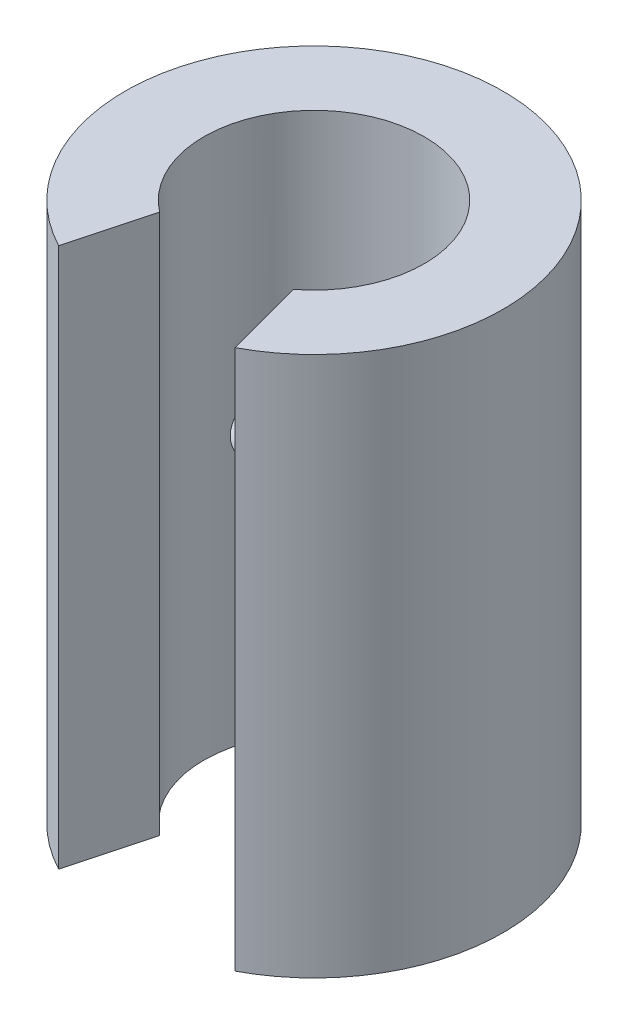
ISO-10303-21;
HEADER;
FILE_DESCRIPTION(('STEP AP214'),'2;1');
FILE_NAME('part.step','',(''),(''),'','','');
FILE_SCHEMA(('AUTOMOTIVE_DESIGN { 1 0 10303 214 1 1 1 1 }'));
ENDSEC;
DATA;
#1=APPLICATION_CONTEXT('core data for automotive mechanical design processes');
#2=APPLICATION_PROTOCOL_DEFINITION('international standard','automotive_design',2000,#1);
#3=PRODUCT_CONTEXT('',#1,'mechanical');
#4=PRODUCT('Part','Part','',(#3));
#5=PRODUCT_RELATED_PRODUCT_CATEGORY('part','',(#4));
#6=PRODUCT_DEFINITION_FORMATION('','',#4);
#7=PRODUCT_DEFINITION_CONTEXT('part definition',#1,'design');
#8=PRODUCT_DEFINITION('design','',#6,#7);
#9=PRODUCT_DEFINITION_SHAPE('','',#8);
#10=(LENGTH_UNIT() NAMED_UNIT(*) SI_UNIT(.MILLI.,.METRE.));
#11=(NAMED_UNIT(*) PLANE_ANGLE_UNIT() SI_UNIT($,.RADIAN.));
#12=(NAMED_UNIT(*) SI_UNIT($,.STERADIAN.) SOLID_ANGLE_UNIT());
#13=UNCERTAINTY_MEASURE_WITH_UNIT(LENGTH_MEASURE(1.E-05),#10,'distance_accuracy_value','');
#14=(GEOMETRIC_REPRESENTATION_CONTEXT(3) GLOBAL_UNCERTAINTY_ASSIGNED_CONTEXT((#13)) GLOBAL_UNIT_ASSIGNED_CONTEXT((#10,
#11,#12)) REPRESENTATION_CONTEXT('',''));
#15=CARTESIAN_POINT('',(0.,0.,0.));
#16=DIRECTION('',(0.,0.,1.));
#17=DIRECTION('',(1.,0.,0.));
#18=AXIS2_PLACEMENT_3D('',#15,#16,#17);
#19=CARTESIAN_POINT('',(0.,31.75,0.));
#20=DIRECTION('',(0.,-1.,0.));
#21=DIRECTION('',(0.,0.,-1.));
#22=AXIS2_PLACEMENT_3D('',#19,#20,#21);
#23=CYLINDRICAL_SURFACE('',#22,11.1125);
#24=CARTESIAN_POINT('',(-9.94763525919603,15.875,-4.953));
#25=CARTESIAN_POINT('',(-9.94763878544441,15.9680026410095,-4.95299521385012));
#26=CARTESIAN_POINT('',(-9.95129743515424,16.0610625330806,-4.94566578220435));
#27=CARTESIAN_POINT('',(-9.96564854455297,16.2444145402521,-4.91668119068409));
#28=CARTESIAN_POINT('',(-9.97634848971295,16.3347036027046,-4.89501078504687));
#29=CARTESIAN_POINT('',(-10.0039251166892,16.5096753956584,-4.83840031691232));
#30=CARTESIAN_POINT('',(-10.0207824766002,16.594374695648,-4.80350175146106));
#31=CARTESIAN_POINT('',(-10.0595532651573,16.7565017686068,-4.72176682728439));
#32=CARTESIAN_POINT('',(-10.0814670320356,16.8339290546502,-4.67492966994317));
#33=CARTESIAN_POINT('',(-10.1303538966716,16.983858850667,-4.56806376764782));
#34=CARTESIAN_POINT('',(-10.1575311829331,17.0558942343518,-4.50747463575308));
#35=CARTESIAN_POINT('',(-10.214687554241,17.1890179409136,-4.37640563836487));
#36=CARTESIAN_POINT('',(-10.2446676914499,17.2501021275111,-4.30592205357193));
#37=CARTESIAN_POINT('',(-10.3089551608932,17.3654058610594,-4.1498017908327));
#38=CARTESIAN_POINT('',(-10.3434061587457,17.4184665516614,-4.06336638468825));
#39=CARTESIAN_POINT('',(-10.4125293728223,17.5091658527226,-3.8828128991285));
#40=CARTESIAN_POINT('',(-10.4472016560369,17.5467995437515,-3.78869238050621));
#41=CARTESIAN_POINT('',(-10.5168911109901,17.6069077524919,-3.59083726421356));
#42=CARTESIAN_POINT('',(-10.5518583367422,17.6286561999488,-3.48686291275156));
#43=CARTESIAN_POINT('',(-10.6192503385392,17.6533083738613,-3.27588671007481));
#44=CARTESIAN_POINT('',(-10.6516753795836,17.6562140670883,-3.16888517600273));
#45=CARTESIAN_POINT('',(-10.7123233105156,17.6427364326878,-2.9573037084751));
#46=CARTESIAN_POINT('',(-10.7406196526224,17.6267535692505,-2.85271975291446));
#47=CARTESIAN_POINT('',(-10.7931346195312,17.5761198584634,-2.64710314885045));
#48=CARTESIAN_POINT('',(-10.8173544371147,17.5414744842265,-2.54606946841483));
#49=CARTESIAN_POINT('',(-10.8603588508228,17.4562638047639,-2.355704925178));
#50=CARTESIAN_POINT('',(-10.8793470324596,17.406533223244,-2.26604609655847));
#51=CARTESIAN_POINT('',(-10.9133613287245,17.2919663526696,-2.09611933957978));
#52=CARTESIAN_POINT('',(-10.9283882059171,17.2271329754869,-2.01584960544596));
#53=CARTESIAN_POINT('',(-10.9542858816446,17.0865978700505,-1.86991993775005));
#54=CARTESIAN_POINT('',(-10.9652789141744,17.0113323595908,-1.80386104185135));
#55=CARTESIAN_POINT('',(-10.9841476703351,16.8505293383283,-1.68516426948346));
#56=CARTESIAN_POINT('',(-10.9920236117828,16.764992545809,-1.63252545533442));
#57=CARTESIAN_POINT('',(-11.0049689833614,16.5871400300533,-1.54283937519475));
#58=CARTESIAN_POINT('',(-11.0100693105048,16.4949124583107,-1.50562161003678));
#59=CARTESIAN_POINT('',(-11.0179213904938,16.305456053637,-1.44704679161751));
#60=CARTESIAN_POINT('',(-11.0206731635485,16.2082272637481,-1.42568960187865));
#61=CARTESIAN_POINT('',(-11.0240313352359,16.0116271405485,-1.39948801301972));
#62=CARTESIAN_POINT('',(-11.0246397413414,15.9122578998094,-1.39462816268456));
#63=CARTESIAN_POINT('',(-11.0237654269374,15.7141062239287,-1.40152178841066));
#64=CARTESIAN_POINT('',(-11.0222827028149,15.6153237898014,-1.41327529317701));
#65=CARTESIAN_POINT('',(-11.0171088401311,15.4211101019721,-1.45305431332347));
#66=CARTESIAN_POINT('',(-11.0134168296156,15.3256801871843,-1.48108625329629));
#67=CARTESIAN_POINT('',(-11.0035644477683,15.140926366157,-1.55258486357255));
#68=CARTESIAN_POINT('',(-10.9974041151882,15.051602364083,-1.59605129155987));
#69=CARTESIAN_POINT('',(-10.9822677047572,14.8816334394566,-1.69707058572878));
#70=CARTESIAN_POINT('',(-10.9732929831453,14.8009843615924,-1.75461666407298));
#71=CARTESIAN_POINT('',(-10.9521591595581,14.6505747390229,-1.88202647918107));
#72=CARTESIAN_POINT('',(-10.9400001468297,14.5808138892381,-1.95188987070681));
#73=CARTESIAN_POINT('',(-10.9121762884238,14.4539622756385,-2.10187504824784));
#74=CARTESIAN_POINT('',(-10.8965061377799,14.3968909471,-2.18201227775251));
#75=CARTESIAN_POINT('',(-10.8615198603376,14.2969719224244,-2.34997731524356));
#76=CARTESIAN_POINT('',(-10.8422036328792,14.2541246190712,-2.43780533551976));
#77=CARTESIAN_POINT('',(-10.7997099004489,14.183088726321,-2.61968463842637));
#78=CARTESIAN_POINT('',(-10.7764856680123,14.1550969807064,-2.71380174020321));
#79=CARTESIAN_POINT('',(-10.7266645738311,14.1149988753039,-2.90448578165293));
#80=CARTESIAN_POINT('',(-10.7000671811269,14.1028950197964,-3.00105310508997));
#81=CARTESIAN_POINT('',(-10.6431023600289,14.0943378855576,-3.19731362866868));
#82=CARTESIAN_POINT('',(-10.6126378334517,14.0984278996433,-3.29700206278628));
#83=CARTESIAN_POINT('',(-10.5495415738334,14.1229785213989,-3.49363765229785));
#84=CARTESIAN_POINT('',(-10.516909295447,14.1434432628999,-3.59058410907501));
#85=CARTESIAN_POINT('',(-10.4489836993877,14.2013058410043,-3.78382959650997));
#86=CARTESIAN_POINT('',(-10.4136372807494,14.2394499056249,-3.87988690866481));
#87=CARTESIAN_POINT('',(-10.3431533705559,14.3317965027538,-4.06405838729572));
#88=CARTESIAN_POINT('',(-10.3080159385766,14.3860034096625,-4.15217038148342));
#89=CARTESIAN_POINT('',(-10.2387777964361,14.5107568021774,-4.32013136721693));
#90=CARTESIAN_POINT('',(-10.2047216991021,14.5816616455604,-4.39973362546179));
#91=CARTESIAN_POINT('',(-10.1405322947787,14.7375523925682,-4.54572695166085));
#92=CARTESIAN_POINT('',(-10.1103992068129,14.8225390817885,-4.61211728209548));
#93=CARTESIAN_POINT('',(-10.0573459647216,15.0007044156151,-4.72665596792438));
#94=CARTESIAN_POINT('',(-10.0341765622355,15.0933908477211,-4.77545191285533));
#95=CARTESIAN_POINT('',(-9.99531269805021,15.2871576857047,-4.85627611753021));
#96=CARTESIAN_POINT('',(-9.97960268576897,15.3882201086029,-4.88833927405916));
#97=CARTESIAN_POINT('',(-9.96152236718018,15.5543690822558,-4.92503310925263));
#98=CARTESIAN_POINT('',(-9.95633453545663,15.6179213858721,-4.93549582324974));
#99=CARTESIAN_POINT('',(-9.94938989341553,15.7459733230858,-4.94948065540629));
#100=CARTESIAN_POINT('',(-9.94763281261338,15.8104728815965,-4.95300332072785));
#101=CARTESIAN_POINT('',(-9.94763525919603,15.875,-4.953));
#102=B_SPLINE_CURVE_WITH_KNOTS('',3,(#24,#25,#26,#27,#28,#29,#30,#31,#32,#33,#34,#35,#36,#37,
#38,#39,#40,#41,#42,#43,#44,#45,#46,#47,#48,#49,#50,#51,#52,#53,#54,#55,#56,#57,#58,#59,#60,#61,
#62,#63,#64,#65,#66,#67,#68,#69,#70,#71,#72,#73,#74,#75,#76,#77,#78,#79,#80,#81,#82,#83,#84,#85,
#86,#87,#88,#89,#90,#91,#92,#93,#94,#95,#96,#97,#98,#99,#100,#101),.UNSPECIFIED.,.T.,.F.,(4,2,2,
2,2,2,2,2,2,2,2,2,2,2,2,2,2,2,2,2,2,2,2,2,2,2,2,2,2,2,2,2,2,2,2,2,2,2,4),(0.,0.278756225709814,
0.557809271777509,0.835994071184758,1.1141974842702,1.40690334600277,1.69971953121749,
2.019640965436,2.33966433840964,2.67352941459083,3.00735964199911,3.33423732419011,
3.66101919584238,3.97227283314657,4.28346650925679,4.58424811237627,4.88500869370169,
5.18234903700803,5.4796868217213,5.77674604639467,6.07380578433726,6.37098284228804,
6.66815523486841,6.96518464116547,7.26220572344057,7.55967863675901,7.85715976384789,
8.15849002347503,8.4598677736675,8.77144079129379,9.08309249094756,9.40930006410828,
9.73559655528312,10.0696631899112,10.4037484676635,10.723840675706,11.0432626258457,
11.2366845985925,11.4300913210989),.UNSPECIFIED.);
#103=CARTESIAN_POINT('',(-9.94763525919603,15.875,-4.953));
#104=VERTEX_POINT('',#103);
#105=EDGE_CURVE('E102',#104,#104,#102,.T.);
#106=ORIENTED_EDGE('',*,*,#105,.T.);
#107=EDGE_LOOP('',(#106));
#108=FACE_BOUND('',#107,.T.);
#109=CARTESIAN_POINT('',(0.,31.75,0.));
#110=DIRECTION('',(0.,1.,0.));
#111=DIRECTION('',(0.,0.,1.));
#112=AXIS2_PLACEMENT_3D('',#109,#110,#111);
#113=CIRCLE('',#112,11.1125);
#114=CARTESIAN_POINT('',(5.19157205151859,31.75,9.82523464777768));
#115=VERTEX_POINT('',#114);
#116=CARTESIAN_POINT('',(-5.19157205151859,31.75,9.82523464777769));
#117=VERTEX_POINT('',#116);
#118=EDGE_CURVE('E11',#115,#117,#113,.T.);
#119=ORIENTED_EDGE('',*,*,#118,.F.);
#120=DIRECTION('',(0.,1.,0.));
#121=VECTOR('',#120,1.);
#122=CARTESIAN_POINT('',(5.19157205151859,0.,9.82523464777768));
#123=LINE('',#122,#121);
#124=CARTESIAN_POINT('',(5.19157205151859,0.,9.82523464777768));
#125=VERTEX_POINT('',#124);
#126=EDGE_CURVE('E110',#125,#115,#123,.T.);
#127=ORIENTED_EDGE('',*,*,#126,.F.);
#128=CARTESIAN_POINT('',(0.,0.,0.));
#129=DIRECTION('',(0.,1.,0.));
#130=DIRECTION('',(0.,0.,1.));
#131=AXIS2_PLACEMENT_3D('',#128,#129,#130);
#132=CIRCLE('',#131,11.1125);
#133=CARTESIAN_POINT('',(-5.19157205151859,0.,9.82523464777768));
#134=VERTEX_POINT('',#133);
#135=EDGE_CURVE('E46',#125,#134,#132,.T.);
#136=ORIENTED_EDGE('',*,*,#135,.T.);
#137=DIRECTION('',(0.,1.,0.));
#138=VECTOR('',#137,1.);
#139=CARTESIAN_POINT('',(-5.19157205151859,0.,9.82523464777769));
#140=LINE('',#139,#138);
#141=EDGE_CURVE('E54',#134,#117,#140,.T.);
#142=ORIENTED_EDGE('',*,*,#141,.T.);
#143=EDGE_LOOP('',(#119,#127,#136,#142));
#144=FACE_BOUND('',#143,.T.);
#145=ADVANCED_FACE('F33',(#108,#144),#23,.T.);
#146=CARTESIAN_POINT('',(0.,31.75,0.));
#147=DIRECTION('',(0.,1.,0.));
#148=DIRECTION('',(0.,0.,1.));
#149=AXIS2_PLACEMENT_3D('',#146,#147,#148);
#150=PLANE('',#149);
#151=DIRECTION('',(-0.258819045102522,0.,-0.965925826289068));
#152=VECTOR('',#151,1.);
#153=CARTESIAN_POINT('',(3.937,31.75,5.14310800975441));
#154=LINE('',#153,#152);
#155=CARTESIAN_POINT('',(3.937,31.75,5.14310800975441));
#156=VERTEX_POINT('',#155);
#157=EDGE_CURVE('E97',#115,#156,#154,.T.);
#158=ORIENTED_EDGE('',*,*,#157,.F.);
#159=ORIENTED_EDGE('',*,*,#118,.T.);
#160=DIRECTION('',(-0.258819045102521,0.,0.965925826289068));
#161=VECTOR('',#160,1.);
#162=CARTESIAN_POINT('',(-3.937,31.75,5.14310800975441));
#163=LINE('',#162,#161);
#164=CARTESIAN_POINT('',(-3.937,31.75,5.14310800975441));
#165=VERTEX_POINT('',#164);
#166=EDGE_CURVE('E99',#165,#117,#163,.T.);
#167=ORIENTED_EDGE('',*,*,#166,.F.);
#168=CARTESIAN_POINT('',(0.,31.75,0.));
#169=DIRECTION('',(0.,1.,0.));
#170=DIRECTION('',(0.,0.,1.));
#171=AXIS2_PLACEMENT_3D('',#168,#169,#170);
#172=CIRCLE('',#171,6.477);
#173=EDGE_CURVE('E86',#156,#165,#172,.T.);
#174=ORIENTED_EDGE('',*,*,#173,.F.);
#175=EDGE_LOOP('',(#158,#159,#167,#174));
#176=FACE_BOUND('',#175,.T.);
#177=ADVANCED_FACE('F118',(#176),#150,.T.);
#178=CARTESIAN_POINT('',(0.,0.,0.));
#179=DIRECTION('',(0.,1.,0.));
#180=DIRECTION('',(0.,0.,1.));
#181=AXIS2_PLACEMENT_3D('',#178,#179,#180);
#182=PLANE('',#181);
#183=ORIENTED_EDGE('',*,*,#135,.F.);
#184=DIRECTION('',(-0.258819045102522,0.,-0.965925826289068));
#185=VECTOR('',#184,1.);
#186=CARTESIAN_POINT('',(3.937,0.,5.14310800975441));
#187=LINE('',#186,#185);
#188=CARTESIAN_POINT('',(3.937,0.,5.14310800975441));
#189=VERTEX_POINT('',#188);
#190=EDGE_CURVE('E88',#125,#189,#187,.T.);
#191=ORIENTED_EDGE('',*,*,#190,.T.);
#192=CARTESIAN_POINT('',(0.,0.,0.));
#193=DIRECTION('',(0.,1.,0.));
#194=DIRECTION('',(0.,0.,1.));
#195=AXIS2_PLACEMENT_3D('',#192,#193,#194);
#196=CIRCLE('',#195,6.477);
#197=CARTESIAN_POINT('',(-3.937,0.,5.14310800975441));
#198=VERTEX_POINT('',#197);
#199=EDGE_CURVE('E83',#189,#198,#196,.T.);
#200=ORIENTED_EDGE('',*,*,#199,.T.);
#201=DIRECTION('',(-0.258819045102521,0.,0.965925826289068));
#202=VECTOR('',#201,1.);
#203=CARTESIAN_POINT('',(-3.937,0.,5.14310800975441));
#204=LINE('',#203,#202);
#205=EDGE_CURVE('E90',#198,#134,#204,.T.);
#206=ORIENTED_EDGE('',*,*,#205,.T.);
#207=EDGE_LOOP('',(#183,#191,#200,#206));
#208=FACE_BOUND('',#207,.T.);
#209=ADVANCED_FACE('F96',(#208),#182,.F.);
#210=CARTESIAN_POINT('',(0.,0.,0.));
#211=DIRECTION('',(0.,1.,0.));
#212=DIRECTION('',(0.,0.,1.));
#213=AXIS2_PLACEMENT_3D('',#210,#211,#212);
#214=CYLINDRICAL_SURFACE('',#213,6.477);
#215=CARTESIAN_POINT('',(-4.17364588818937,15.875,-4.953));
#216=CARTESIAN_POINT('',(-4.17365928133899,15.7970542137427,-4.95299127707594));
#217=CARTESIAN_POINT('',(-4.17982845763029,15.7189806978667,-4.94781041179372));
#218=CARTESIAN_POINT('',(-4.20359303092594,15.5658386466402,-4.92763185771974));
#219=CARTESIAN_POINT('',(-4.22122103176411,15.4907793366613,-4.91260615640917));
#220=CARTESIAN_POINT('',(-4.26537898513917,15.3466742949469,-4.87431044561063));
#221=CARTESIAN_POINT('',(-4.29180298885806,15.2775687616332,-4.85113838188277));
#222=CARTESIAN_POINT('',(-4.35125408045843,15.1451893366271,-4.79788646525112));
#223=CARTESIAN_POINT('',(-4.38428401530775,15.0819179765338,-4.76780363316963));
#224=CARTESIAN_POINT('',(-4.47524712838995,14.926698645572,-4.68288722607045));
#225=CARTESIAN_POINT('',(-4.53659988750899,14.8391107046798,-4.62375251653681));
#226=CARTESIAN_POINT('',(-4.66529466751512,14.6781024271898,-4.49388165040904));
#227=CARTESIAN_POINT('',(-4.73264816852109,14.6047101371649,-4.42312302791765));
#228=CARTESIAN_POINT('',(-4.87199292558831,14.4697470851497,-4.26922967951009));
#229=CARTESIAN_POINT('',(-4.94406354443492,14.4086261276981,-4.18577310859165));
#230=CARTESIAN_POINT('',(-5.08806112706366,14.3016233809296,-4.00950544771887));
#231=CARTESIAN_POINT('',(-5.1599880718574,14.2557434885358,-3.91669319521631));
#232=CARTESIAN_POINT('',(-5.31393236513931,14.173708474785,-3.70587446532187));
#233=CARTESIAN_POINT('',(-5.39550780272342,14.1406687448811,-3.58630378152439));
#234=CARTESIAN_POINT('',(-5.55206804721529,14.100140190295,-3.33877378005452));
#235=CARTESIAN_POINT('',(-5.62706079331397,14.0926201628296,-3.21082490170075));
#236=CARTESIAN_POINT('',(-5.75001964036668,14.1046441701601,-2.9834833157733));
#237=CARTESIAN_POINT('',(-5.80007556038045,14.117937831338,-2.88487953878391));
#238=CARTESIAN_POINT('',(-5.89368855114889,14.1619154424951,-2.68844953419336));
#239=CARTESIAN_POINT('',(-5.93725024252437,14.1925869528856,-2.59062280109931));
#240=CARTESIAN_POINT('',(-6.01731881895006,14.2719936053774,-2.39880551444076));
#241=CARTESIAN_POINT('',(-6.05379005012847,14.3208166164015,-2.30483613223137));
#242=CARTESIAN_POINT('',(-6.11912477695937,14.4359701149386,-2.12531743256755));
#243=CARTESIAN_POINT('',(-6.14799001713311,14.502296580836,-2.0397661871424));
#244=CARTESIAN_POINT('',(-6.19616110109175,14.6441536039776,-1.88809553540963));
#245=CARTESIAN_POINT('',(-6.21608527428953,14.7183576054265,-1.82092801709297));
#246=CARTESIAN_POINT('',(-6.2503633969282,14.8778207124593,-1.69955114625131));
#247=CARTESIAN_POINT('',(-6.26471867181072,14.9630771810161,-1.64533871149545));
#248=CARTESIAN_POINT('',(-6.28806033214355,15.1387111642693,-1.5537014094979));
#249=CARTESIAN_POINT('',(-6.29722786242201,15.2287767516368,-1.51572324892023));
#250=CARTESIAN_POINT('',(-6.31154018843434,15.4142016509941,-1.4549810873193));
#251=CARTESIAN_POINT('',(-6.3166851573339,15.5095607349168,-1.43221643138193));
#252=CARTESIAN_POINT('',(-6.32330405814576,15.7025080121208,-1.40270660343177));
#253=CARTESIAN_POINT('',(-6.32479065972965,15.8000873276516,-1.39590614792085));
#254=CARTESIAN_POINT('',(-6.324244094672,15.9950337683082,-1.39838012812838));
#255=CARTESIAN_POINT('',(-6.32221088845335,16.0924008910358,-1.40765474459679));
#256=CARTESIAN_POINT('',(-6.31446456181981,16.2842892001653,-1.44200305151695));
#257=CARTESIAN_POINT('',(-6.30874664622097,16.3788065098735,-1.46709732833275));
#258=CARTESIAN_POINT('',(-6.29323315406693,16.5621659583395,-1.53227279355807));
#259=CARTESIAN_POINT('',(-6.2834377515144,16.6510083390826,-1.57235334243598));
#260=CARTESIAN_POINT('',(-6.25923993018678,16.8203849582305,-1.66606488363969));
#261=CARTESIAN_POINT('',(-6.24484375983854,16.900930270045,-1.71967747709068));
#262=CARTESIAN_POINT('',(-6.21087648186194,17.0516302441368,-1.83857339709456));
#263=CARTESIAN_POINT('',(-6.19130575904454,17.121785678463,-1.90385585568897));
#264=CARTESIAN_POINT('',(-6.14648314748208,17.250149577201,-2.04393857506849));
#265=CARTESIAN_POINT('',(-6.12121449793323,17.3083218061341,-2.11876662692152));
#266=CARTESIAN_POINT('',(-6.06484640894341,17.4113020096705,-2.27509677390375));
#267=CARTESIAN_POINT('',(-6.03374656471116,17.4561090559264,-2.3565993321441));
#268=CARTESIAN_POINT('',(-5.96477556666428,17.5330922262308,-2.52618575748924));
#269=CARTESIAN_POINT('',(-5.92672097188204,17.5648227872791,-2.61439636345853));
#270=CARTESIAN_POINT('',(-5.84504505601766,17.6137611431995,-2.79223295558057));
#271=CARTESIAN_POINT('',(-5.80142175417119,17.6309637538821,-2.88185943536496));
#272=CARTESIAN_POINT('',(-5.70527826339559,17.6524721291593,-3.06810259999759));
#273=CARTESIAN_POINT('',(-5.65231216335083,17.655498986032,-3.16463437900966));
#274=CARTESIAN_POINT('',(-5.54186378091867,17.6464858489645,-3.35430272352912));
#275=CARTESIAN_POINT('',(-5.48437996900324,17.6344407314442,-3.44743812338981));
#276=CARTESIAN_POINT('',(-5.35763193207588,17.5939007093431,-3.64178844017637));
#277=CARTESIAN_POINT('',(-5.28786438408728,17.5632838966517,-3.74223134979965));
#278=CARTESIAN_POINT('',(-5.146026390816,17.4857410566817,-3.93501030311356));
#279=CARTESIAN_POINT('',(-5.07395273462254,17.438791303323,-4.02733430709062));
#280=CARTESIAN_POINT('',(-4.91937127057718,17.3217846049098,-4.21522933535645));
#281=CARTESIAN_POINT('',(-4.83686269344342,17.2493671168205,-4.30933718776802));
#282=CARTESIAN_POINT('',(-4.67616145026674,17.0850496195726,-4.48318735635158));
#283=CARTESIAN_POINT('',(-4.59796281237027,16.9931774680715,-4.56294991509044));
#284=CARTESIAN_POINT('',(-4.47957301632524,16.8271711517962,-4.67857723126883));
#285=CARTESIAN_POINT('',(-4.43604378780244,16.7590999709805,-4.71974995888582));
#286=CARTESIAN_POINT('',(-4.35591254367445,16.6148125925785,-4.79379932202719));
#287=CARTESIAN_POINT('',(-4.31929919268429,16.5386100491968,-4.82668956287183));
#288=CARTESIAN_POINT('',(-4.26312630750191,16.3958199865195,-4.87630810984912));
#289=CARTESIAN_POINT('',(-4.24159210315819,16.3306975806097,-4.89499173511902));
#290=CARTESIAN_POINT('',(-4.20672775822628,16.1967179193473,-4.92498827823532));
#291=CARTESIAN_POINT('',(-4.19337622880368,16.1278709174901,-4.93632041684114));
#292=CARTESIAN_POINT('',(-4.1811325855967,16.0278162895817,-4.94668361886291));
#293=CARTESIAN_POINT('',(-4.17833395847177,15.9973770267039,-4.94904655208486));
#294=CARTESIAN_POINT('',(-4.17458774721323,15.9362984614824,-4.95220665149699));
#295=CARTESIAN_POINT('',(-4.17364062014232,15.9056591116176,-4.95300343106555));
#296=CARTESIAN_POINT('',(-4.17364588818937,15.875,-4.953));
#297=B_SPLINE_CURVE_WITH_KNOTS('',3,(#215,#216,#217,#218,#219,#220,#221,#222,#223,#224,#225,
#226,#227,#228,#229,#230,#231,#232,#233,#234,#235,#236,#237,#238,#239,#240,#241,#242,#243,#244,
#245,#246,#247,#248,#249,#250,#251,#252,#253,#254,#255,#256,#257,#258,#259,#260,#261,#262,#263,
#264,#265,#266,#267,#268,#269,#270,#271,#272,#273,#274,#275,#276,#277,#278,#279,#280,#281,#282,
#283,#284,#285,#286,#287,#288,#289,#290,#291,#292,#293,#294,#295,#296),.UNSPECIFIED.,.T.,.F.,(4,
2,2,2,2,2,2,2,2,2,2,2,2,2,2,2,2,2,2,2,2,2,2,2,2,2,2,2,2,2,2,2,2,2,2,2,2,2,2,2,4),(0.,
0.233679649981983,0.468027117136152,0.699648247191568,0.931369415287901,1.29596141526145,
1.6612665479654,2.03818091124778,2.41514216823244,2.85819562647853,3.30070717042505,
3.6334569260197,3.96596878969431,4.30011171271668,4.63417792938618,4.93879891906558,
5.24334736200445,5.53647533910411,5.82959069675652,6.12168949858339,6.41379158482413,
6.70627457481986,6.99874508467561,7.29082005852009,7.58287331801297,7.87579714422018,
8.16874131221809,8.47097439694551,8.77331528575582,9.10246646843475,9.43172957345596,
9.80848030118843,10.1857806178676,10.6176751235165,11.0489553199077,11.3202442281388,
11.5910845501605,11.8035787738057,12.015515159375,12.1074077794036,12.1993230812509),.UNSPECIFIED.);
#298=CARTESIAN_POINT('',(-4.17364588818937,15.875,-4.953));
#299=VERTEX_POINT('',#298);
#300=EDGE_CURVE('E37',#299,#299,#297,.T.);
#301=ORIENTED_EDGE('',*,*,#300,.T.);
#302=EDGE_LOOP('',(#301));
#303=FACE_BOUND('',#302,.T.);
#304=ORIENTED_EDGE('',*,*,#173,.T.);
#305=DIRECTION('',(0.,1.,0.));
#306=VECTOR('',#305,1.);
#307=CARTESIAN_POINT('',(-3.937,0.,5.14310800975441));
#308=LINE('',#307,#306);
#309=EDGE_CURVE('E80',#198,#165,#308,.T.);
#310=ORIENTED_EDGE('',*,*,#309,.F.);
#311=ORIENTED_EDGE('',*,*,#199,.F.);
#312=DIRECTION('',(0.,1.,0.));
#313=VECTOR('',#312,1.);
#314=CARTESIAN_POINT('',(3.937,0.,5.14310800975441));
#315=LINE('',#314,#313);
#316=EDGE_CURVE('E63',#189,#156,#315,.T.);
#317=ORIENTED_EDGE('',*,*,#316,.T.);
#318=EDGE_LOOP('',(#304,#310,#311,#317));
#319=FACE_BOUND('',#318,.T.);
#320=ADVANCED_FACE('F81',(#303,#319),#214,.F.);
#321=CARTESIAN_POINT('',(3.937,0.,5.14310800975441));
#322=DIRECTION('',(0.965925826289068,0.,-0.258819045102522));
#323=DIRECTION('',(-0.258819045102522,0.,-0.965925826289068));
#324=AXIS2_PLACEMENT_3D('',#321,#322,#323);
#325=PLANE('',#324);
#326=ORIENTED_EDGE('',*,*,#157,.T.);
#327=ORIENTED_EDGE('',*,*,#316,.F.);
#328=ORIENTED_EDGE('',*,*,#190,.F.);
#329=ORIENTED_EDGE('',*,*,#126,.T.);
#330=EDGE_LOOP('',(#326,#327,#328,#329));
#331=FACE_BOUND('',#330,.T.);
#332=ADVANCED_FACE('F116',(#331),#325,.F.);
#333=CARTESIAN_POINT('',(-3.937,0.,5.14310800975441));
#334=DIRECTION('',(-0.965925826289068,0.,-0.258819045102521));
#335=DIRECTION('',(-0.258819045102521,0.,0.965925826289068));
#336=AXIS2_PLACEMENT_3D('',#333,#334,#335);
#337=PLANE('',#336);
#338=ORIENTED_EDGE('',*,*,#166,.T.);
#339=ORIENTED_EDGE('',*,*,#141,.F.);
#340=ORIENTED_EDGE('',*,*,#205,.F.);
#341=ORIENTED_EDGE('',*,*,#309,.T.);
#342=EDGE_LOOP('',(#338,#339,#340,#341));
#343=FACE_BOUND('',#342,.T.);
#344=ADVANCED_FACE('F91',(#343),#337,.F.);
#345=CARTESIAN_POINT('',(-31.75,15.875,-3.175));
#346=DIRECTION('',(1.,0.,0.));
#347=DIRECTION('',(0.,0.,-1.));
#348=AXIS2_PLACEMENT_3D('',#345,#346,#347);
#349=CYLINDRICAL_SURFACE('',#348,1.778);
#350=ORIENTED_EDGE('',*,*,#300,.F.);
#351=EDGE_LOOP('',(#350));
#352=FACE_BOUND('',#351,.T.);
#353=ORIENTED_EDGE('',*,*,#105,.F.);
#354=EDGE_LOOP('',(#353));
#355=FACE_BOUND('',#354,.T.);
#356=ADVANCED_FACE('F132',(#352,#355),#349,.F.);
#357=CLOSED_SHELL('',(#145,#177,#209,#320,#332,#344,#356));
#358=MANIFOLD_SOLID_BREP('B2',#357);
#359=ADVANCED_BREP_SHAPE_REPRESENTATION('',(#18,#358),#14);
#360=SHAPE_DEFINITION_REPRESENTATION(#9,#359);
ENDSEC;
END-ISO-10303-21;
